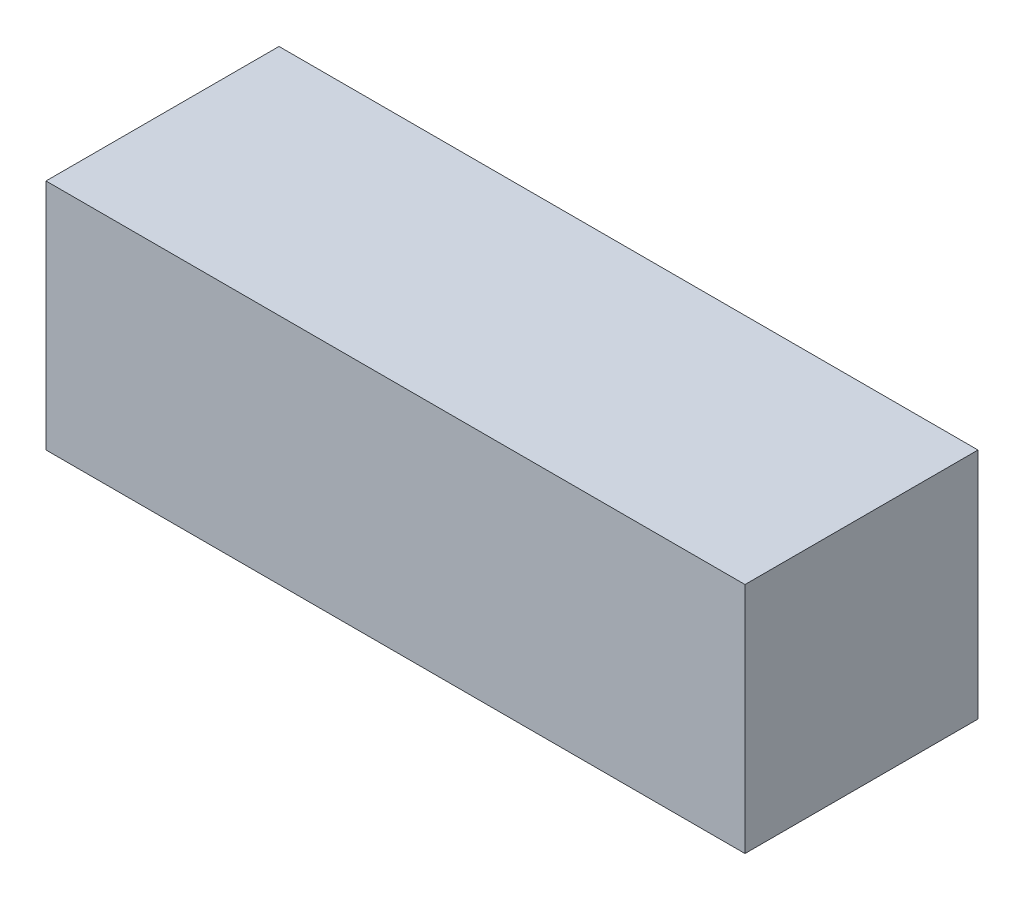
ISO-10303-21;
HEADER;
FILE_DESCRIPTION(('STEP AP214'),'2;1');
FILE_NAME('part.step','',(''),(''),'','','');
FILE_SCHEMA(('AUTOMOTIVE_DESIGN { 1 0 10303 214 1 1 1 1 }'));
ENDSEC;
DATA;
#1=APPLICATION_CONTEXT('core data for automotive mechanical design processes');
#2=APPLICATION_PROTOCOL_DEFINITION('international standard','automotive_design',2000,#1);
#3=PRODUCT_CONTEXT('',#1,'mechanical');
#4=PRODUCT('Part','Part','',(#3));
#5=PRODUCT_RELATED_PRODUCT_CATEGORY('part','',(#4));
#6=PRODUCT_DEFINITION_FORMATION('','',#4);
#7=PRODUCT_DEFINITION_CONTEXT('part definition',#1,'design');
#8=PRODUCT_DEFINITION('design','',#6,#7);
#9=PRODUCT_DEFINITION_SHAPE('','',#8);
#10=(LENGTH_UNIT() NAMED_UNIT(*) SI_UNIT(.MILLI.,.METRE.));
#11=(NAMED_UNIT(*) PLANE_ANGLE_UNIT() SI_UNIT($,.RADIAN.));
#12=(NAMED_UNIT(*) SI_UNIT($,.STERADIAN.) SOLID_ANGLE_UNIT());
#13=UNCERTAINTY_MEASURE_WITH_UNIT(LENGTH_MEASURE(1.E-05),#10,'distance_accuracy_value','');
#14=(GEOMETRIC_REPRESENTATION_CONTEXT(3) GLOBAL_UNCERTAINTY_ASSIGNED_CONTEXT((#13)) GLOBAL_UNIT_ASSIGNED_CONTEXT((#10,
#11,#12)) REPRESENTATION_CONTEXT('',''));
#15=CARTESIAN_POINT('',(0.,0.,0.));
#16=DIRECTION('',(0.,0.,1.));
#17=DIRECTION('',(1.,0.,0.));
#18=AXIS2_PLACEMENT_3D('',#15,#16,#17);
#19=CARTESIAN_POINT('',(-60.,-20.,40.));
#20=DIRECTION('',(1.,0.,0.));
#21=DIRECTION('',(0.,0.,-1.));
#22=AXIS2_PLACEMENT_3D('',#19,#20,#21);
#23=PLANE('',#22);
#24=DIRECTION('',(0.,-1.,0.));
#25=VECTOR('',#24,1.);
#26=CARTESIAN_POINT('',(-60.,-20.,0.));
#27=LINE('',#26,#25);
#28=CARTESIAN_POINT('',(-60.,20.,0.));
#29=VERTEX_POINT('',#28);
#30=CARTESIAN_POINT('',(-60.,-20.,0.));
#31=VERTEX_POINT('',#30);
#32=EDGE_CURVE('E107',#29,#31,#27,.T.);
#33=ORIENTED_EDGE('',*,*,#32,.T.);
#34=DIRECTION('',(0.,0.,-1.));
#35=VECTOR('',#34,1.);
#36=CARTESIAN_POINT('',(-60.,-20.,40.));
#37=LINE('',#36,#35);
#38=CARTESIAN_POINT('',(-60.,-20.,40.));
#39=VERTEX_POINT('',#38);
#40=EDGE_CURVE('E11',#39,#31,#37,.T.);
#41=ORIENTED_EDGE('',*,*,#40,.F.);
#42=DIRECTION('',(0.,-1.,0.));
#43=VECTOR('',#42,1.);
#44=CARTESIAN_POINT('',(-60.,-20.,40.));
#45=LINE('',#44,#43);
#46=CARTESIAN_POINT('',(-60.,20.,40.));
#47=VERTEX_POINT('',#46);
#48=EDGE_CURVE('E91',#47,#39,#45,.T.);
#49=ORIENTED_EDGE('',*,*,#48,.F.);
#50=DIRECTION('',(0.,0.,-1.));
#51=VECTOR('',#50,1.);
#52=CARTESIAN_POINT('',(-60.,20.,40.));
#53=LINE('',#52,#51);
#54=EDGE_CURVE('E103',#47,#29,#53,.T.);
#55=ORIENTED_EDGE('',*,*,#54,.T.);
#56=EDGE_LOOP('',(#33,#41,#49,#55));
#57=FACE_BOUND('',#56,.T.);
#58=ADVANCED_FACE('F39',(#57),#23,.F.);
#59=CARTESIAN_POINT('',(60.,-20.,40.));
#60=DIRECTION('',(0.,1.,0.));
#61=DIRECTION('',(-1.,0.,0.));
#62=AXIS2_PLACEMENT_3D('',#59,#60,#61);
#63=PLANE('',#62);
#64=DIRECTION('',(1.,0.,0.));
#65=VECTOR('',#64,1.);
#66=CARTESIAN_POINT('',(60.,-20.,0.));
#67=LINE('',#66,#65);
#68=CARTESIAN_POINT('',(60.,-20.,0.));
#69=VERTEX_POINT('',#68);
#70=EDGE_CURVE('E96',#31,#69,#67,.T.);
#71=ORIENTED_EDGE('',*,*,#70,.T.);
#72=DIRECTION('',(0.,0.,-1.));
#73=VECTOR('',#72,1.);
#74=CARTESIAN_POINT('',(60.,-20.,40.));
#75=LINE('',#74,#73);
#76=CARTESIAN_POINT('',(60.,-20.,40.));
#77=VERTEX_POINT('',#76);
#78=EDGE_CURVE('E48',#77,#69,#75,.T.);
#79=ORIENTED_EDGE('',*,*,#78,.F.);
#80=DIRECTION('',(1.,0.,0.));
#81=VECTOR('',#80,1.);
#82=CARTESIAN_POINT('',(60.,-20.,40.));
#83=LINE('',#82,#81);
#84=EDGE_CURVE('E86',#39,#77,#83,.T.);
#85=ORIENTED_EDGE('',*,*,#84,.F.);
#86=ORIENTED_EDGE('',*,*,#40,.T.);
#87=EDGE_LOOP('',(#71,#79,#85,#86));
#88=FACE_BOUND('',#87,.T.);
#89=ADVANCED_FACE('F95',(#88),#63,.F.);
#90=CARTESIAN_POINT('',(60.,-20.,40.));
#91=DIRECTION('',(-1.,0.,0.));
#92=DIRECTION('',(0.,0.,1.));
#93=AXIS2_PLACEMENT_3D('',#90,#91,#92);
#94=PLANE('',#93);
#95=DIRECTION('',(0.,1.,0.));
#96=VECTOR('',#95,1.);
#97=CARTESIAN_POINT('',(60.,-20.,0.));
#98=LINE('',#97,#96);
#99=CARTESIAN_POINT('',(60.,20.,0.));
#100=VERTEX_POINT('',#99);
#101=EDGE_CURVE('E73',#69,#100,#98,.T.);
#102=ORIENTED_EDGE('',*,*,#101,.T.);
#103=DIRECTION('',(0.,0.,-1.));
#104=VECTOR('',#103,1.);
#105=CARTESIAN_POINT('',(60.,20.,40.));
#106=LINE('',#105,#104);
#107=CARTESIAN_POINT('',(60.,20.,40.));
#108=VERTEX_POINT('',#107);
#109=EDGE_CURVE('E98',#108,#100,#106,.T.);
#110=ORIENTED_EDGE('',*,*,#109,.F.);
#111=DIRECTION('',(0.,1.,0.));
#112=VECTOR('',#111,1.);
#113=CARTESIAN_POINT('',(60.,-20.,40.));
#114=LINE('',#113,#112);
#115=EDGE_CURVE('E89',#77,#108,#114,.T.);
#116=ORIENTED_EDGE('',*,*,#115,.F.);
#117=ORIENTED_EDGE('',*,*,#78,.T.);
#118=EDGE_LOOP('',(#102,#110,#116,#117));
#119=FACE_BOUND('',#118,.T.);
#120=ADVANCED_FACE('F99',(#119),#94,.F.);
#121=CARTESIAN_POINT('',(60.,20.,40.));
#122=DIRECTION('',(0.,-1.,0.));
#123=DIRECTION('',(1.,0.,0.));
#124=AXIS2_PLACEMENT_3D('',#121,#122,#123);
#125=PLANE('',#124);
#126=DIRECTION('',(-1.,0.,0.));
#127=VECTOR('',#126,1.);
#128=CARTESIAN_POINT('',(60.,20.,0.));
#129=LINE('',#128,#127);
#130=EDGE_CURVE('E79',#100,#29,#129,.T.);
#131=ORIENTED_EDGE('',*,*,#130,.T.);
#132=ORIENTED_EDGE('',*,*,#54,.F.);
#133=DIRECTION('',(-1.,0.,0.));
#134=VECTOR('',#133,1.);
#135=CARTESIAN_POINT('',(60.,20.,40.));
#136=LINE('',#135,#134);
#137=EDGE_CURVE('E56',#108,#47,#136,.T.);
#138=ORIENTED_EDGE('',*,*,#137,.F.);
#139=ORIENTED_EDGE('',*,*,#109,.T.);
#140=EDGE_LOOP('',(#131,#132,#138,#139));
#141=FACE_BOUND('',#140,.T.);
#142=ADVANCED_FACE('F120',(#141),#125,.F.);
#143=CARTESIAN_POINT('',(0.,0.,40.));
#144=DIRECTION('',(0.,0.,1.));
#145=DIRECTION('',(1.,0.,0.));
#146=AXIS2_PLACEMENT_3D('',#143,#144,#145);
#147=PLANE('',#146);
#148=ORIENTED_EDGE('',*,*,#48,.T.);
#149=ORIENTED_EDGE('',*,*,#84,.T.);
#150=ORIENTED_EDGE('',*,*,#115,.T.);
#151=ORIENTED_EDGE('',*,*,#137,.T.);
#152=EDGE_LOOP('',(#148,#149,#150,#151));
#153=FACE_BOUND('',#152,.T.);
#154=ADVANCED_FACE('F87',(#153),#147,.T.);
#155=CARTESIAN_POINT('',(0.,0.,0.));
#156=DIRECTION('',(0.,0.,1.));
#157=DIRECTION('',(1.,0.,0.));
#158=AXIS2_PLACEMENT_3D('',#155,#156,#157);
#159=PLANE('',#158);
#160=ORIENTED_EDGE('',*,*,#32,.F.);
#161=ORIENTED_EDGE('',*,*,#130,.F.);
#162=ORIENTED_EDGE('',*,*,#101,.F.);
#163=ORIENTED_EDGE('',*,*,#70,.F.);
#164=EDGE_LOOP('',(#160,#161,#162,#163));
#165=FACE_BOUND('',#164,.T.);
#166=ADVANCED_FACE('F123',(#165),#159,.F.);
#167=CLOSED_SHELL('',(#58,#89,#120,#142,#154,#166));
#168=MANIFOLD_SOLID_BREP('B2',#167);
#169=ADVANCED_BREP_SHAPE_REPRESENTATION('',(#18,#168),#14);
#170=SHAPE_DEFINITION_REPRESENTATION(#9,#169);
ENDSEC;
END-ISO-10303-21;
